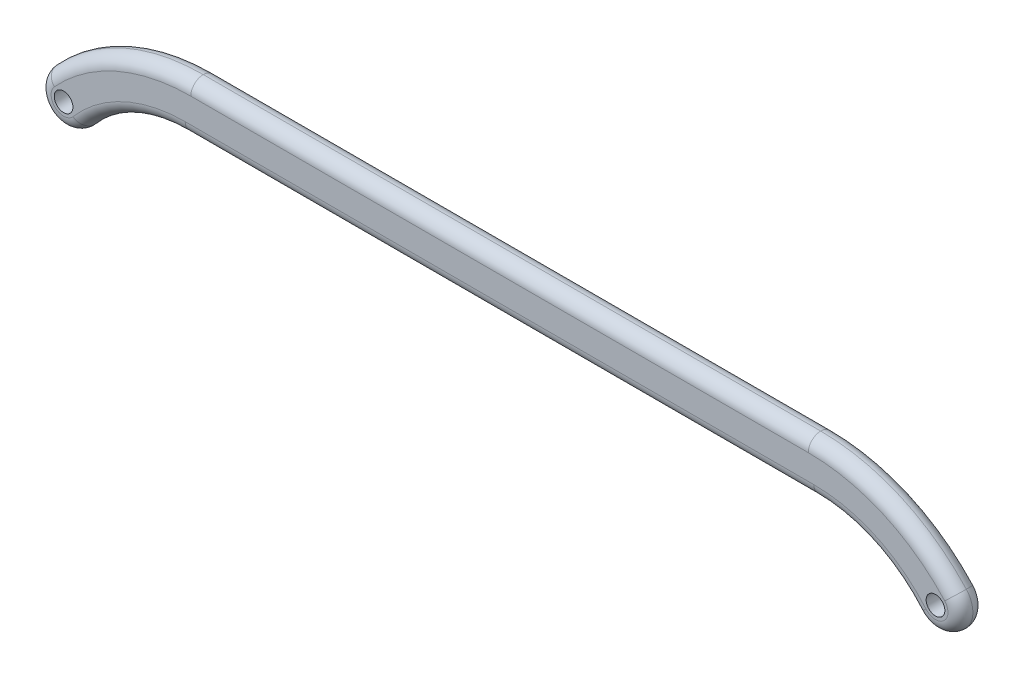
ISO-10303-21;
HEADER;
FILE_DESCRIPTION(('STEP AP214'),'2;1');
FILE_NAME('part.step','',(''),(''),'','','');
FILE_SCHEMA(('AUTOMOTIVE_DESIGN { 1 0 10303 214 1 1 1 1 }'));
ENDSEC;
DATA;
#1=APPLICATION_CONTEXT('core data for automotive mechanical design processes');
#2=APPLICATION_PROTOCOL_DEFINITION('international standard','automotive_design',2000,#1);
#3=PRODUCT_CONTEXT('',#1,'mechanical');
#4=PRODUCT('Part','Part','',(#3));
#5=PRODUCT_RELATED_PRODUCT_CATEGORY('part','',(#4));
#6=PRODUCT_DEFINITION_FORMATION('','',#4);
#7=PRODUCT_DEFINITION_CONTEXT('part definition',#1,'design');
#8=PRODUCT_DEFINITION('design','',#6,#7);
#9=PRODUCT_DEFINITION_SHAPE('','',#8);
#10=(LENGTH_UNIT() NAMED_UNIT(*) SI_UNIT(.MILLI.,.METRE.));
#11=(NAMED_UNIT(*) PLANE_ANGLE_UNIT() SI_UNIT($,.RADIAN.));
#12=(NAMED_UNIT(*) SI_UNIT($,.STERADIAN.) SOLID_ANGLE_UNIT());
#13=UNCERTAINTY_MEASURE_WITH_UNIT(LENGTH_MEASURE(1.E-05),#10,'distance_accuracy_value','');
#14=(GEOMETRIC_REPRESENTATION_CONTEXT(3) GLOBAL_UNCERTAINTY_ASSIGNED_CONTEXT((#13)) GLOBAL_UNIT_ASSIGNED_CONTEXT((#10,
#11,#12)) REPRESENTATION_CONTEXT('',''));
#15=CARTESIAN_POINT('',(0.,0.,0.));
#16=DIRECTION('',(0.,0.,1.));
#17=DIRECTION('',(1.,0.,0.));
#18=AXIS2_PLACEMENT_3D('',#15,#16,#17);
#19=CARTESIAN_POINT('',(19.5292240623264,-16.6883662486972,4.));
#20=DIRECTION('',(0.,0.,-1.));
#21=DIRECTION('',(-1.,0.,0.));
#22=AXIS2_PLACEMENT_3D('',#19,#20,#21);
#23=PLANE('',#22);
#24=CARTESIAN_POINT('',(0.,0.,4.));
#25=DIRECTION('',(0.,0.,-1.));
#26=DIRECTION('',(-1.,0.,0.));
#27=AXIS2_PLACEMENT_3D('',#24,#25,#26);
#28=CIRCLE('',#27,2.);
#29=CARTESIAN_POINT('',(-1.47572010082704,1.34990747239025,4.));
#30=VERTEX_POINT('',#29);
#31=CARTESIAN_POINT('',(1.52047225372434,-1.29929370261479,4.));
#32=VERTEX_POINT('',#31);
#33=EDGE_CURVE('E191',#30,#32,#28,.F.);
#34=ORIENTED_EDGE('',*,*,#33,.T.);
#35=CARTESIAN_POINT('',(19.5292240623264,-16.6883662486972,4.));
#36=DIRECTION('',(0.,0.,-1.));
#37=DIRECTION('',(-1.,0.,0.));
#38=AXIS2_PLACEMENT_3D('',#35,#36,#37);
#39=CIRCLE('',#38,23.6883662486972);
#40=CARTESIAN_POINT('',(19.5292240623264,7.,4.));
#41=VERTEX_POINT('',#40);
#42=EDGE_CURVE('E193',#32,#41,#39,.T.);
#43=ORIENTED_EDGE('',*,*,#42,.T.);
#44=DIRECTION('',(1.,0.,0.));
#45=VECTOR('',#44,1.);
#46=CARTESIAN_POINT('',(19.5292240623264,7.,4.));
#47=LINE('',#46,#45);
#48=CARTESIAN_POINT('',(120.470775937674,7.,4.));
#49=VERTEX_POINT('',#48);
#50=EDGE_CURVE('E177',#41,#49,#47,.T.);
#51=ORIENTED_EDGE('',*,*,#50,.T.);
#52=CARTESIAN_POINT('',(120.470775937674,-16.6883662486972,4.));
#53=DIRECTION('',(0.,0.,-1.));
#54=DIRECTION('',(-1.,0.,0.));
#55=AXIS2_PLACEMENT_3D('',#52,#53,#54);
#56=CIRCLE('',#55,23.6883662486972);
#57=CARTESIAN_POINT('',(138.479527746276,-1.29929370261479,4.));
#58=VERTEX_POINT('',#57);
#59=EDGE_CURVE('E181',#49,#58,#56,.T.);
#60=ORIENTED_EDGE('',*,*,#59,.T.);
#61=CARTESIAN_POINT('',(140.,0.,4.));
#62=DIRECTION('',(0.,0.,-1.));
#63=DIRECTION('',(-1.,0.,0.));
#64=AXIS2_PLACEMENT_3D('',#61,#62,#63);
#65=CIRCLE('',#64,2.);
#66=CARTESIAN_POINT('',(141.475720100827,1.34990747239024,4.));
#67=VERTEX_POINT('',#66);
#68=EDGE_CURVE('E183',#58,#67,#65,.F.);
#69=ORIENTED_EDGE('',*,*,#68,.T.);
#70=CARTESIAN_POINT('',(119.569860683868,-18.6883662486972,4.));
#71=DIRECTION('',(0.,0.,-1.));
#72=DIRECTION('',(-1.,0.,0.));
#73=AXIS2_PLACEMENT_3D('',#70,#71,#72);
#74=CIRCLE('',#73,29.6883662486972);
#75=CARTESIAN_POINT('',(119.569860683868,11.,4.));
#76=VERTEX_POINT('',#75);
#77=EDGE_CURVE('E185',#67,#76,#74,.F.);
#78=ORIENTED_EDGE('',*,*,#77,.T.);
#79=DIRECTION('',(-1.,0.,0.));
#80=VECTOR('',#79,1.);
#81=CARTESIAN_POINT('',(19.5292240623264,11.,4.));
#82=LINE('',#81,#80);
#83=CARTESIAN_POINT('',(20.4301393161317,11.,4.));
#84=VERTEX_POINT('',#83);
#85=EDGE_CURVE('E187',#76,#84,#82,.T.);
#86=ORIENTED_EDGE('',*,*,#85,.T.);
#87=CARTESIAN_POINT('',(20.4301393161317,-18.6883662486972,4.));
#88=DIRECTION('',(0.,0.,-1.));
#89=DIRECTION('',(-1.,0.,0.));
#90=AXIS2_PLACEMENT_3D('',#87,#88,#89);
#91=CIRCLE('',#90,29.6883662486972);
#92=EDGE_CURVE('E189',#84,#30,#91,.F.);
#93=ORIENTED_EDGE('',*,*,#92,.T.);
#94=EDGE_LOOP('',(#34,#43,#51,#60,#69,#78,#86,#93));
#95=FACE_BOUND('',#94,.T.);
#96=CARTESIAN_POINT('',(0.,0.,4.));
#97=DIRECTION('',(0.,0.,1.));
#98=DIRECTION('',(1.,0.,0.));
#99=AXIS2_PLACEMENT_3D('',#96,#97,#98);
#100=CIRCLE('',#99,1.5);
#101=CARTESIAN_POINT('',(1.5,0.,4.));
#102=VERTEX_POINT('',#101);
#103=EDGE_CURVE('E174',#102,#102,#100,.T.);
#104=ORIENTED_EDGE('',*,*,#103,.F.);
#105=EDGE_LOOP('',(#104));
#106=FACE_BOUND('',#105,.T.);
#107=CARTESIAN_POINT('',(140.,0.,4.));
#108=DIRECTION('',(0.,0.,1.));
#109=DIRECTION('',(-1.,0.,0.));
#110=AXIS2_PLACEMENT_3D('',#107,#108,#109);
#111=CIRCLE('',#110,1.5);
#112=CARTESIAN_POINT('',(138.5,0.,4.));
#113=VERTEX_POINT('',#112);
#114=EDGE_CURVE('E166',#113,#113,#111,.T.);
#115=ORIENTED_EDGE('',*,*,#114,.F.);
#116=EDGE_LOOP('',(#115));
#117=FACE_BOUND('',#116,.T.);
#118=ADVANCED_FACE('F33',(#95,#106,#117),#23,.F.);
#119=CARTESIAN_POINT('',(19.5292240623264,-16.6883662486972,0.));
#120=DIRECTION('',(0.,0.,-1.));
#121=DIRECTION('',(-1.,0.,0.));
#122=AXIS2_PLACEMENT_3D('',#119,#120,#121);
#123=PLANE('',#122);
#124=DIRECTION('',(1.,0.,0.));
#125=VECTOR('',#124,1.);
#126=CARTESIAN_POINT('',(19.5292240623264,7.,0.));
#127=LINE('',#126,#125);
#128=CARTESIAN_POINT('',(120.470775937674,7.,0.));
#129=VERTEX_POINT('',#128);
#130=CARTESIAN_POINT('',(19.5292240623264,7.,0.));
#131=VERTEX_POINT('',#130);
#132=EDGE_CURVE('E196',#129,#131,#127,.F.);
#133=ORIENTED_EDGE('',*,*,#132,.T.);
#134=CARTESIAN_POINT('',(19.5292240623264,-16.6883662486972,0.));
#135=DIRECTION('',(0.,0.,-1.));
#136=DIRECTION('',(-1.,0.,0.));
#137=AXIS2_PLACEMENT_3D('',#134,#135,#136);
#138=CIRCLE('',#137,23.6883662486972);
#139=CARTESIAN_POINT('',(1.52047225372434,-1.29929370261479,0.));
#140=VERTEX_POINT('',#139);
#141=EDGE_CURVE('E11',#131,#140,#138,.F.);
#142=ORIENTED_EDGE('',*,*,#141,.T.);
#143=CARTESIAN_POINT('',(0.,0.,0.));
#144=DIRECTION('',(0.,0.,-1.));
#145=DIRECTION('',(-1.,0.,0.));
#146=AXIS2_PLACEMENT_3D('',#143,#144,#145);
#147=CIRCLE('',#146,2.);
#148=CARTESIAN_POINT('',(-1.47572010082704,1.34990747239025,0.));
#149=VERTEX_POINT('',#148);
#150=EDGE_CURVE('E43',#140,#149,#147,.T.);
#151=ORIENTED_EDGE('',*,*,#150,.T.);
#152=CARTESIAN_POINT('',(20.4301393161317,-18.6883662486972,0.));
#153=DIRECTION('',(0.,0.,-1.));
#154=DIRECTION('',(-1.,0.,0.));
#155=AXIS2_PLACEMENT_3D('',#152,#153,#154);
#156=CIRCLE('',#155,29.6883662486972);
#157=CARTESIAN_POINT('',(20.4301393161317,11.,0.));
#158=VERTEX_POINT('',#157);
#159=EDGE_CURVE('E133',#149,#158,#156,.T.);
#160=ORIENTED_EDGE('',*,*,#159,.T.);
#161=DIRECTION('',(-1.,0.,0.));
#162=VECTOR('',#161,1.);
#163=CARTESIAN_POINT('',(119.569860683868,11.,0.));
#164=LINE('',#163,#162);
#165=CARTESIAN_POINT('',(119.569860683868,11.,0.));
#166=VERTEX_POINT('',#165);
#167=EDGE_CURVE('E137',#158,#166,#164,.F.);
#168=ORIENTED_EDGE('',*,*,#167,.T.);
#169=CARTESIAN_POINT('',(119.569860683868,-18.6883662486972,0.));
#170=DIRECTION('',(0.,0.,-1.));
#171=DIRECTION('',(-1.,0.,0.));
#172=AXIS2_PLACEMENT_3D('',#169,#170,#171);
#173=CIRCLE('',#172,29.6883662486972);
#174=CARTESIAN_POINT('',(141.475720100827,1.34990747239023,0.));
#175=VERTEX_POINT('',#174);
#176=EDGE_CURVE('E147',#166,#175,#173,.T.);
#177=ORIENTED_EDGE('',*,*,#176,.T.);
#178=CARTESIAN_POINT('',(140.,0.,0.));
#179=DIRECTION('',(0.,0.,-1.));
#180=DIRECTION('',(-1.,0.,0.));
#181=AXIS2_PLACEMENT_3D('',#178,#179,#180);
#182=CIRCLE('',#181,2.);
#183=CARTESIAN_POINT('',(138.479527746276,-1.29929370261479,0.));
#184=VERTEX_POINT('',#183);
#185=EDGE_CURVE('E200',#175,#184,#182,.T.);
#186=ORIENTED_EDGE('',*,*,#185,.T.);
#187=CARTESIAN_POINT('',(120.470775937674,-16.6883662486972,0.));
#188=DIRECTION('',(0.,0.,-1.));
#189=DIRECTION('',(-1.,0.,0.));
#190=AXIS2_PLACEMENT_3D('',#187,#188,#189);
#191=CIRCLE('',#190,23.6883662486972);
#192=EDGE_CURVE('E198',#184,#129,#191,.F.);
#193=ORIENTED_EDGE('',*,*,#192,.T.);
#194=EDGE_LOOP('',(#133,#142,#151,#160,#168,#177,#186,#193));
#195=FACE_BOUND('',#194,.T.);
#196=CARTESIAN_POINT('',(0.,0.,0.));
#197=DIRECTION('',(0.,0.,1.));
#198=DIRECTION('',(1.,0.,0.));
#199=AXIS2_PLACEMENT_3D('',#196,#197,#198);
#200=CIRCLE('',#199,1.5);
#201=CARTESIAN_POINT('',(1.5,0.,0.));
#202=VERTEX_POINT('',#201);
#203=EDGE_CURVE('E171',#202,#202,#200,.T.);
#204=ORIENTED_EDGE('',*,*,#203,.T.);
#205=EDGE_LOOP('',(#204));
#206=FACE_BOUND('',#205,.T.);
#207=CARTESIAN_POINT('',(140.,0.,0.));
#208=DIRECTION('',(0.,0.,1.));
#209=DIRECTION('',(-1.,0.,0.));
#210=AXIS2_PLACEMENT_3D('',#207,#208,#209);
#211=CIRCLE('',#210,1.5);
#212=CARTESIAN_POINT('',(138.5,0.,0.));
#213=VERTEX_POINT('',#212);
#214=EDGE_CURVE('E164',#213,#213,#211,.T.);
#215=ORIENTED_EDGE('',*,*,#214,.T.);
#216=EDGE_LOOP('',(#215));
#217=FACE_BOUND('',#216,.T.);
#218=ADVANCED_FACE('F135',(#195,#206,#217),#123,.T.);
#219=CARTESIAN_POINT('',(0.,0.,4.));
#220=DIRECTION('',(0.,0.,-1.));
#221=DIRECTION('',(-1.,0.,0.));
#222=AXIS2_PLACEMENT_3D('',#219,#220,#221);
#223=CYLINDRICAL_SURFACE('',#222,1.5);
#224=ORIENTED_EDGE('',*,*,#103,.T.);
#225=EDGE_LOOP('',(#224));
#226=FACE_BOUND('',#225,.T.);
#227=ORIENTED_EDGE('',*,*,#203,.F.);
#228=EDGE_LOOP('',(#227));
#229=FACE_BOUND('',#228,.T.);
#230=ADVANCED_FACE('F275',(#226,#229),#223,.F.);
#231=CARTESIAN_POINT('',(140.,0.,4.));
#232=DIRECTION('',(0.,0.,-1.));
#233=DIRECTION('',(-1.,0.,0.));
#234=AXIS2_PLACEMENT_3D('',#231,#232,#233);
#235=CYLINDRICAL_SURFACE('',#234,1.5);
#236=ORIENTED_EDGE('',*,*,#114,.T.);
#237=EDGE_LOOP('',(#236));
#238=FACE_BOUND('',#237,.T.);
#239=ORIENTED_EDGE('',*,*,#214,.F.);
#240=EDGE_LOOP('',(#239));
#241=FACE_BOUND('',#240,.T.);
#242=ADVANCED_FACE('F270',(#238,#241),#235,.F.);
#243=CARTESIAN_POINT('',(119.569860683868,-18.6883662486972,2.));
#244=DIRECTION('',(0.,0.,-1.));
#245=DIRECTION('',(-1.,0.,0.));
#246=AXIS2_PLACEMENT_3D('',#243,#244,#245);
#247=TOROIDAL_SURFACE('',#246,29.6883662486972,2.);
#248=CARTESIAN_POINT('',(141.475720100827,1.34990747239024,2.));
#249=DIRECTION('',(0.67495373619513,-0.737860050413515,0.));
#250=DIRECTION('',(0.737860050413515,0.67495373619513,0.));
#251=AXIS2_PLACEMENT_3D('',#248,#249,#250);
#252=CIRCLE('',#251,2.);
#253=CARTESIAN_POINT('',(142.951440201654,2.6998149447805,2.));
#254=VERTEX_POINT('',#253);
#255=EDGE_CURVE('E154',#175,#254,#252,.T.);
#256=ORIENTED_EDGE('',*,*,#255,.F.);
#257=ORIENTED_EDGE('',*,*,#176,.F.);
#258=CARTESIAN_POINT('',(119.569860683868,11.,2.));
#259=DIRECTION('',(-1.,0.,0.));
#260=DIRECTION('',(0.,0.,1.));
#261=AXIS2_PLACEMENT_3D('',#258,#259,#260);
#262=CIRCLE('',#261,2.);
#263=CARTESIAN_POINT('',(119.569860683868,13.,2.));
#264=VERTEX_POINT('',#263);
#265=EDGE_CURVE('E37',#264,#166,#262,.T.);
#266=ORIENTED_EDGE('',*,*,#265,.F.);
#267=CARTESIAN_POINT('',(119.569860683868,-18.6883662486972,2.));
#268=DIRECTION('',(0.,0.,-1.));
#269=DIRECTION('',(-1.,0.,0.));
#270=AXIS2_PLACEMENT_3D('',#267,#268,#269);
#271=CIRCLE('',#270,31.6883662486972);
#272=EDGE_CURVE('E81',#254,#264,#271,.F.);
#273=ORIENTED_EDGE('',*,*,#272,.F.);
#274=EDGE_LOOP('',(#256,#257,#266,#273));
#275=FACE_BOUND('',#274,.T.);
#276=ADVANCED_FACE('F35',(#275),#247,.T.);
#277=CARTESIAN_POINT('',(20.4301393161317,11.,2.));
#278=DIRECTION('',(1.,0.,0.));
#279=DIRECTION('',(0.,0.,-1.));
#280=AXIS2_PLACEMENT_3D('',#277,#278,#279);
#281=CYLINDRICAL_SURFACE('',#280,2.);
#282=ORIENTED_EDGE('',*,*,#265,.T.);
#283=ORIENTED_EDGE('',*,*,#167,.F.);
#284=CARTESIAN_POINT('',(20.4301393161317,11.,2.));
#285=DIRECTION('',(-1.,0.,0.));
#286=DIRECTION('',(0.,0.,1.));
#287=AXIS2_PLACEMENT_3D('',#284,#285,#286);
#288=CIRCLE('',#287,2.);
#289=CARTESIAN_POINT('',(20.4301393161317,13.,2.));
#290=VERTEX_POINT('',#289);
#291=EDGE_CURVE('E145',#290,#158,#288,.T.);
#292=ORIENTED_EDGE('',*,*,#291,.F.);
#293=DIRECTION('',(-1.,0.,0.));
#294=VECTOR('',#293,1.);
#295=CARTESIAN_POINT('',(20.4301393161317,13.,2.));
#296=LINE('',#295,#294);
#297=EDGE_CURVE('E155',#264,#290,#296,.T.);
#298=ORIENTED_EDGE('',*,*,#297,.F.);
#299=EDGE_LOOP('',(#282,#283,#292,#298));
#300=FACE_BOUND('',#299,.T.);
#301=ADVANCED_FACE('F143',(#300),#281,.T.);
#302=CARTESIAN_POINT('',(119.569860683868,-18.6883662486972,2.));
#303=DIRECTION('',(0.,0.,-1.));
#304=DIRECTION('',(-1.,0.,0.));
#305=AXIS2_PLACEMENT_3D('',#302,#303,#304);
#306=TOROIDAL_SURFACE('',#305,29.6883662486972,2.);
#307=CARTESIAN_POINT('',(141.475720100827,1.34990747239025,2.));
#308=DIRECTION('',(0.674953736195128,-0.737860050413516,0.));
#309=DIRECTION('',(0.737860050413516,0.674953736195128,0.));
#310=AXIS2_PLACEMENT_3D('',#307,#308,#309);
#311=CIRCLE('',#310,2.);
#312=EDGE_CURVE('E245',#254,#67,#311,.T.);
#313=ORIENTED_EDGE('',*,*,#312,.F.);
#314=ORIENTED_EDGE('',*,*,#272,.T.);
#315=CARTESIAN_POINT('',(119.569860683868,11.,2.));
#316=DIRECTION('',(-1.,0.,0.));
#317=DIRECTION('',(0.,0.,1.));
#318=AXIS2_PLACEMENT_3D('',#315,#316,#317);
#319=CIRCLE('',#318,2.);
#320=EDGE_CURVE('E158',#76,#264,#319,.T.);
#321=ORIENTED_EDGE('',*,*,#320,.F.);
#322=ORIENTED_EDGE('',*,*,#77,.F.);
#323=EDGE_LOOP('',(#313,#314,#321,#322));
#324=FACE_BOUND('',#323,.T.);
#325=ADVANCED_FACE('F253',(#324),#306,.T.);
#326=CARTESIAN_POINT('',(140.,0.,2.));
#327=DIRECTION('',(0.,0.,-1.));
#328=DIRECTION('',(-1.,0.,0.));
#329=AXIS2_PLACEMENT_3D('',#326,#327,#328);
#330=DEGENERATE_TOROIDAL_SURFACE('',#329,2.,2.,.T.);
#331=ORIENTED_EDGE('',*,*,#185,.F.);
#332=ORIENTED_EDGE('',*,*,#255,.T.);
#333=CARTESIAN_POINT('',(140.,0.,2.));
#334=DIRECTION('',(0.,0.,-1.));
#335=DIRECTION('',(-1.,0.,0.));
#336=AXIS2_PLACEMENT_3D('',#333,#334,#335);
#337=CIRCLE('',#336,4.);
#338=CARTESIAN_POINT('',(136.959055492551,-2.59858740522958,2.));
#339=VERTEX_POINT('',#338);
#340=EDGE_CURVE('E242',#339,#254,#337,.F.);
#341=ORIENTED_EDGE('',*,*,#340,.F.);
#342=CARTESIAN_POINT('',(138.479527746276,-1.2992937026148,2.));
#343=DIRECTION('',(-0.649646851307391,0.760236126862169,0.));
#344=DIRECTION('',(-0.760236126862169,-0.649646851307391,0.));
#345=AXIS2_PLACEMENT_3D('',#342,#343,#344);
#346=CIRCLE('',#345,2.);
#347=EDGE_CURVE('E239',#184,#339,#346,.T.);
#348=ORIENTED_EDGE('',*,*,#347,.F.);
#349=EDGE_LOOP('',(#331,#332,#341,#348));
#350=FACE_BOUND('',#349,.T.);
#351=ADVANCED_FACE('F262',(#350),#330,.T.);
#352=CARTESIAN_POINT('',(20.4301393161317,-18.6883662486972,2.));
#353=DIRECTION('',(0.,0.,-1.));
#354=DIRECTION('',(-1.,0.,0.));
#355=AXIS2_PLACEMENT_3D('',#352,#353,#354);
#356=TOROIDAL_SURFACE('',#355,29.6883662486972,2.);
#357=ORIENTED_EDGE('',*,*,#291,.T.);
#358=ORIENTED_EDGE('',*,*,#159,.F.);
#359=CARTESIAN_POINT('',(-1.47572010082704,1.34990747239026,2.));
#360=DIRECTION('',(-0.674953736195126,-0.737860050413518,0.));
#361=DIRECTION('',(0.737860050413518,-0.674953736195126,0.));
#362=AXIS2_PLACEMENT_3D('',#359,#360,#361);
#363=CIRCLE('',#362,2.);
#364=CARTESIAN_POINT('',(-2.95144020165408,2.69981494478051,2.));
#365=VERTEX_POINT('',#364);
#366=EDGE_CURVE('E237',#365,#149,#363,.T.);
#367=ORIENTED_EDGE('',*,*,#366,.F.);
#368=CARTESIAN_POINT('',(20.4301393161317,-18.6883662486972,2.));
#369=DIRECTION('',(0.,0.,-1.));
#370=DIRECTION('',(-1.,0.,0.));
#371=AXIS2_PLACEMENT_3D('',#368,#369,#370);
#372=CIRCLE('',#371,31.6883662486972);
#373=EDGE_CURVE('E152',#290,#365,#372,.F.);
#374=ORIENTED_EDGE('',*,*,#373,.F.);
#375=EDGE_LOOP('',(#357,#358,#367,#374));
#376=FACE_BOUND('',#375,.T.);
#377=ADVANCED_FACE('F150',(#376),#356,.T.);
#378=CARTESIAN_POINT('',(19.5292240623264,11.,2.));
#379=DIRECTION('',(-1.,0.,0.));
#380=DIRECTION('',(0.,0.,1.));
#381=AXIS2_PLACEMENT_3D('',#378,#379,#380);
#382=CYLINDRICAL_SURFACE('',#381,2.);
#383=ORIENTED_EDGE('',*,*,#320,.T.);
#384=ORIENTED_EDGE('',*,*,#297,.T.);
#385=CARTESIAN_POINT('',(20.4301393161317,11.,2.));
#386=DIRECTION('',(-1.,0.,0.));
#387=DIRECTION('',(0.,0.,1.));
#388=AXIS2_PLACEMENT_3D('',#385,#386,#387);
#389=CIRCLE('',#388,2.);
#390=EDGE_CURVE('E234',#84,#290,#389,.T.);
#391=ORIENTED_EDGE('',*,*,#390,.F.);
#392=ORIENTED_EDGE('',*,*,#85,.F.);
#393=EDGE_LOOP('',(#383,#384,#391,#392));
#394=FACE_BOUND('',#393,.T.);
#395=ADVANCED_FACE('F250',(#394),#382,.T.);
#396=CARTESIAN_POINT('',(140.,0.,2.));
#397=DIRECTION('',(0.,0.,-1.));
#398=DIRECTION('',(-1.,0.,0.));
#399=AXIS2_PLACEMENT_3D('',#396,#397,#398);
#400=DEGENERATE_TOROIDAL_SURFACE('',#399,2.,2.,.T.);
#401=ORIENTED_EDGE('',*,*,#312,.T.);
#402=ORIENTED_EDGE('',*,*,#68,.F.);
#403=CARTESIAN_POINT('',(138.479527746276,-1.29929370261479,2.));
#404=DIRECTION('',(-0.649646851307393,0.760236126862167,0.));
#405=DIRECTION('',(-0.760236126862168,-0.649646851307393,0.));
#406=AXIS2_PLACEMENT_3D('',#403,#404,#405);
#407=CIRCLE('',#406,2.);
#408=EDGE_CURVE('E231',#339,#58,#407,.T.);
#409=ORIENTED_EDGE('',*,*,#408,.F.);
#410=ORIENTED_EDGE('',*,*,#340,.T.);
#411=EDGE_LOOP('',(#401,#402,#409,#410));
#412=FACE_BOUND('',#411,.T.);
#413=ADVANCED_FACE('F257',(#412),#400,.T.);
#414=CARTESIAN_POINT('',(120.470775937674,-16.6883662486972,2.));
#415=DIRECTION('',(0.,0.,-1.));
#416=DIRECTION('',(-1.,0.,0.));
#417=AXIS2_PLACEMENT_3D('',#414,#415,#416);
#418=TOROIDAL_SURFACE('',#417,23.6883662486972,2.);
#419=ORIENTED_EDGE('',*,*,#192,.F.);
#420=ORIENTED_EDGE('',*,*,#347,.T.);
#421=CARTESIAN_POINT('',(120.470775937674,-16.6883662486972,2.));
#422=DIRECTION('',(0.,0.,-1.));
#423=DIRECTION('',(-1.,0.,0.));
#424=AXIS2_PLACEMENT_3D('',#421,#422,#423);
#425=CIRCLE('',#424,21.6883662486972);
#426=CARTESIAN_POINT('',(120.470775937674,5.,2.));
#427=VERTEX_POINT('',#426);
#428=EDGE_CURVE('E228',#427,#339,#425,.T.);
#429=ORIENTED_EDGE('',*,*,#428,.F.);
#430=CARTESIAN_POINT('',(120.470775937674,7.00000000000001,2.));
#431=DIRECTION('',(-1.,0.,0.));
#432=DIRECTION('',(0.,0.,1.));
#433=AXIS2_PLACEMENT_3D('',#430,#431,#432);
#434=CIRCLE('',#433,2.);
#435=EDGE_CURVE('E225',#129,#427,#434,.T.);
#436=ORIENTED_EDGE('',*,*,#435,.F.);
#437=EDGE_LOOP('',(#419,#420,#429,#436));
#438=FACE_BOUND('',#437,.T.);
#439=ADVANCED_FACE('F265',(#438),#418,.T.);
#440=CARTESIAN_POINT('',(0.,0.,2.));
#441=DIRECTION('',(0.,0.,-1.));
#442=DIRECTION('',(-1.,0.,0.));
#443=AXIS2_PLACEMENT_3D('',#440,#441,#442);
#444=TOROIDAL_SURFACE('',#443,2.,2.);
#445=ORIENTED_EDGE('',*,*,#366,.T.);
#446=ORIENTED_EDGE('',*,*,#150,.F.);
#447=CARTESIAN_POINT('',(1.52047225372434,-1.29929370261479,2.));
#448=DIRECTION('',(0.649646851307392,0.760236126862168,0.));
#449=DIRECTION('',(-0.760236126862169,0.649646851307392,0.));
#450=AXIS2_PLACEMENT_3D('',#447,#448,#449);
#451=CIRCLE('',#450,2.);
#452=CARTESIAN_POINT('',(3.04094450744867,-2.59858740522957,2.));
#453=VERTEX_POINT('',#452);
#454=EDGE_CURVE('E52',#453,#140,#451,.T.);
#455=ORIENTED_EDGE('',*,*,#454,.F.);
#456=CARTESIAN_POINT('',(0.,0.,2.));
#457=DIRECTION('',(0.,0.,-1.));
#458=DIRECTION('',(-1.,0.,0.));
#459=AXIS2_PLACEMENT_3D('',#456,#457,#458);
#460=CIRCLE('',#459,4.);
#461=EDGE_CURVE('E219',#365,#453,#460,.F.);
#462=ORIENTED_EDGE('',*,*,#461,.F.);
#463=EDGE_LOOP('',(#445,#446,#455,#462));
#464=FACE_BOUND('',#463,.T.);
#465=ADVANCED_FACE('F312',(#464),#444,.T.);
#466=CARTESIAN_POINT('',(20.4301393161317,-18.6883662486972,2.));
#467=DIRECTION('',(0.,0.,-1.));
#468=DIRECTION('',(-1.,0.,0.));
#469=AXIS2_PLACEMENT_3D('',#466,#467,#468);
#470=TOROIDAL_SURFACE('',#469,29.6883662486972,2.);
#471=ORIENTED_EDGE('',*,*,#390,.T.);
#472=ORIENTED_EDGE('',*,*,#373,.T.);
#473=CARTESIAN_POINT('',(-1.47572010082704,1.34990747239025,2.));
#474=DIRECTION('',(-0.674953736195126,-0.737860050413518,0.));
#475=DIRECTION('',(0.737860050413518,-0.674953736195126,0.));
#476=AXIS2_PLACEMENT_3D('',#473,#474,#475);
#477=CIRCLE('',#476,2.);
#478=EDGE_CURVE('E216',#30,#365,#477,.T.);
#479=ORIENTED_EDGE('',*,*,#478,.F.);
#480=ORIENTED_EDGE('',*,*,#92,.F.);
#481=EDGE_LOOP('',(#471,#472,#479,#480));
#482=FACE_BOUND('',#481,.T.);
#483=ADVANCED_FACE('F308',(#482),#470,.T.);
#484=CARTESIAN_POINT('',(120.470775937674,-16.6883662486972,2.));
#485=DIRECTION('',(0.,0.,-1.));
#486=DIRECTION('',(-1.,0.,0.));
#487=AXIS2_PLACEMENT_3D('',#484,#485,#486);
#488=TOROIDAL_SURFACE('',#487,23.6883662486972,2.);
#489=ORIENTED_EDGE('',*,*,#408,.T.);
#490=ORIENTED_EDGE('',*,*,#59,.F.);
#491=CARTESIAN_POINT('',(120.470775937674,7.00000000000001,2.));
#492=DIRECTION('',(-1.,0.,0.));
#493=DIRECTION('',(0.,0.,1.));
#494=AXIS2_PLACEMENT_3D('',#491,#492,#493);
#495=CIRCLE('',#494,2.);
#496=EDGE_CURVE('E213',#427,#49,#495,.T.);
#497=ORIENTED_EDGE('',*,*,#496,.F.);
#498=ORIENTED_EDGE('',*,*,#428,.T.);
#499=EDGE_LOOP('',(#489,#490,#497,#498));
#500=FACE_BOUND('',#499,.T.);
#501=ADVANCED_FACE('F304',(#500),#488,.T.);
#502=CARTESIAN_POINT('',(19.5292240623264,7.,2.));
#503=DIRECTION('',(-1.,0.,0.));
#504=DIRECTION('',(0.,0.,1.));
#505=AXIS2_PLACEMENT_3D('',#502,#503,#504);
#506=CYLINDRICAL_SURFACE('',#505,2.);
#507=CARTESIAN_POINT('',(19.5292240623264,7.,2.));
#508=DIRECTION('',(-1.,0.,0.));
#509=DIRECTION('',(0.,0.,1.));
#510=AXIS2_PLACEMENT_3D('',#507,#508,#509);
#511=CIRCLE('',#510,2.);
#512=CARTESIAN_POINT('',(19.5292240623264,5.,2.));
#513=VERTEX_POINT('',#512);
#514=EDGE_CURVE('E223',#131,#513,#511,.T.);
#515=ORIENTED_EDGE('',*,*,#514,.F.);
#516=ORIENTED_EDGE('',*,*,#132,.F.);
#517=ORIENTED_EDGE('',*,*,#435,.T.);
#518=DIRECTION('',(1.,0.,0.));
#519=VECTOR('',#518,1.);
#520=CARTESIAN_POINT('',(120.470775937674,5.,2.));
#521=LINE('',#520,#519);
#522=EDGE_CURVE('E210',#513,#427,#521,.T.);
#523=ORIENTED_EDGE('',*,*,#522,.F.);
#524=EDGE_LOOP('',(#515,#516,#517,#523));
#525=FACE_BOUND('',#524,.T.);
#526=ADVANCED_FACE('F301',(#525),#506,.T.);
#527=CARTESIAN_POINT('',(19.5292240623264,-16.6883662486972,2.));
#528=DIRECTION('',(0.,0.,-1.));
#529=DIRECTION('',(-1.,0.,0.));
#530=AXIS2_PLACEMENT_3D('',#527,#528,#529);
#531=TOROIDAL_SURFACE('',#530,23.6883662486972,2.);
#532=ORIENTED_EDGE('',*,*,#141,.F.);
#533=ORIENTED_EDGE('',*,*,#514,.T.);
#534=CARTESIAN_POINT('',(19.5292240623264,-16.6883662486972,2.));
#535=DIRECTION('',(0.,0.,-1.));
#536=DIRECTION('',(-1.,0.,0.));
#537=AXIS2_PLACEMENT_3D('',#534,#535,#536);
#538=CIRCLE('',#537,21.6883662486972);
#539=EDGE_CURVE('E208',#453,#513,#538,.T.);
#540=ORIENTED_EDGE('',*,*,#539,.F.);
#541=ORIENTED_EDGE('',*,*,#454,.T.);
#542=EDGE_LOOP('',(#532,#533,#540,#541));
#543=FACE_BOUND('',#542,.T.);
#544=ADVANCED_FACE('F297',(#543),#531,.T.);
#545=CARTESIAN_POINT('',(0.,0.,2.));
#546=DIRECTION('',(0.,0.,-1.));
#547=DIRECTION('',(-1.,0.,0.));
#548=AXIS2_PLACEMENT_3D('',#545,#546,#547);
#549=TOROIDAL_SURFACE('',#548,2.,2.);
#550=ORIENTED_EDGE('',*,*,#478,.T.);
#551=ORIENTED_EDGE('',*,*,#461,.T.);
#552=CARTESIAN_POINT('',(1.52047225372434,-1.29929370261479,2.));
#553=DIRECTION('',(0.649646851307391,0.760236126862169,0.));
#554=DIRECTION('',(-0.760236126862169,0.649646851307392,0.));
#555=AXIS2_PLACEMENT_3D('',#552,#553,#554);
#556=CIRCLE('',#555,2.);
#557=EDGE_CURVE('E205',#32,#453,#556,.T.);
#558=ORIENTED_EDGE('',*,*,#557,.F.);
#559=ORIENTED_EDGE('',*,*,#33,.F.);
#560=EDGE_LOOP('',(#550,#551,#558,#559));
#561=FACE_BOUND('',#560,.T.);
#562=ADVANCED_FACE('F293',(#561),#549,.T.);
#563=CARTESIAN_POINT('',(19.5292240623264,7.,2.));
#564=DIRECTION('',(1.,0.,0.));
#565=DIRECTION('',(0.,0.,-1.));
#566=AXIS2_PLACEMENT_3D('',#563,#564,#565);
#567=CYLINDRICAL_SURFACE('',#566,2.);
#568=ORIENTED_EDGE('',*,*,#496,.T.);
#569=ORIENTED_EDGE('',*,*,#50,.F.);
#570=CARTESIAN_POINT('',(19.5292240623264,7.,2.));
#571=DIRECTION('',(-1.,0.,0.));
#572=DIRECTION('',(0.,0.,1.));
#573=AXIS2_PLACEMENT_3D('',#570,#571,#572);
#574=CIRCLE('',#573,2.);
#575=EDGE_CURVE('E93',#513,#41,#574,.T.);
#576=ORIENTED_EDGE('',*,*,#575,.F.);
#577=ORIENTED_EDGE('',*,*,#522,.T.);
#578=EDGE_LOOP('',(#568,#569,#576,#577));
#579=FACE_BOUND('',#578,.T.);
#580=ADVANCED_FACE('F290',(#579),#567,.T.);
#581=CARTESIAN_POINT('',(19.5292240623264,-16.6883662486972,2.));
#582=DIRECTION('',(0.,0.,-1.));
#583=DIRECTION('',(-1.,0.,0.));
#584=AXIS2_PLACEMENT_3D('',#581,#582,#583);
#585=TOROIDAL_SURFACE('',#584,23.6883662486972,2.);
#586=ORIENTED_EDGE('',*,*,#557,.T.);
#587=ORIENTED_EDGE('',*,*,#539,.T.);
#588=ORIENTED_EDGE('',*,*,#575,.T.);
#589=ORIENTED_EDGE('',*,*,#42,.F.);
#590=EDGE_LOOP('',(#586,#587,#588,#589));
#591=FACE_BOUND('',#590,.T.);
#592=ADVANCED_FACE('F287',(#591),#585,.T.);
#593=CLOSED_SHELL('',(#118,#218,#230,#242,#276,#301,#325,#351,#377,#395,#413,#439,#465,#483,
#501,#526,#544,#562,#580,#592));
#594=MANIFOLD_SOLID_BREP('B2',#593);
#595=ADVANCED_BREP_SHAPE_REPRESENTATION('',(#18,#594),#14);
#596=SHAPE_DEFINITION_REPRESENTATION(#9,#595);
ENDSEC;
END-ISO-10303-21;
